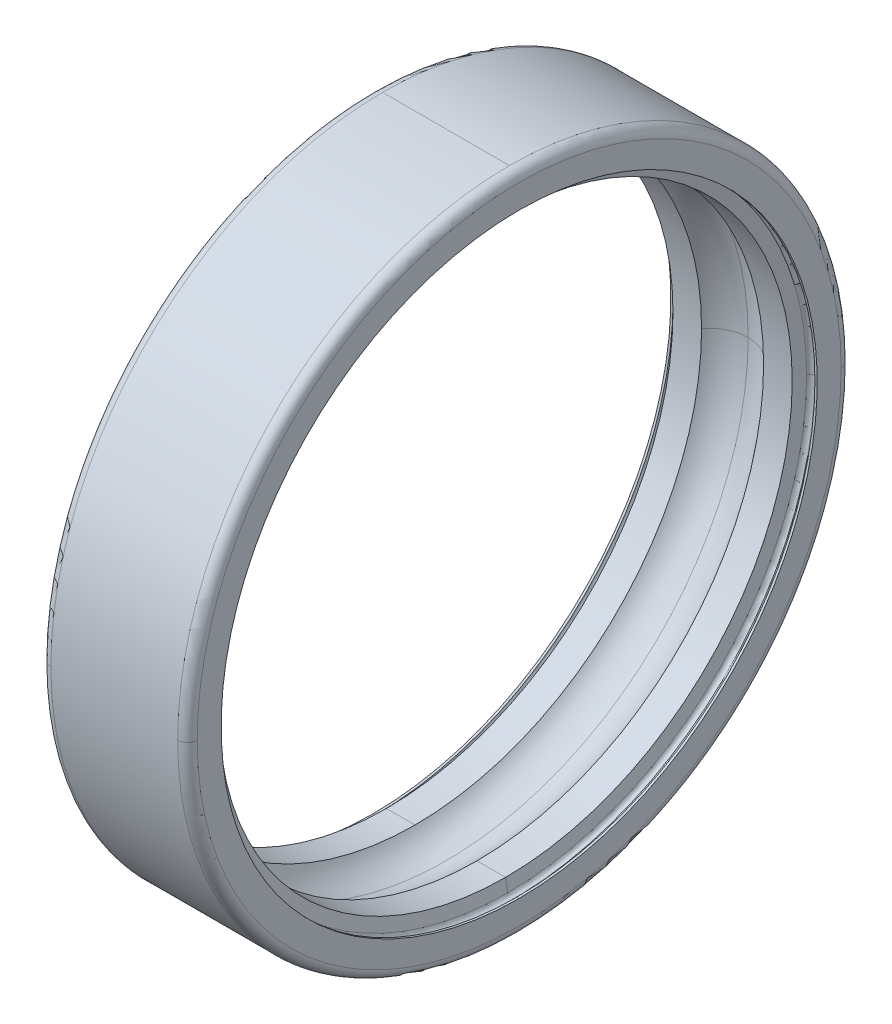
ISO-10303-21;
HEADER;
FILE_DESCRIPTION(('STEP AP214'),'2;1');
FILE_NAME('part.step','',(''),(''),'','','');
FILE_SCHEMA(('AUTOMOTIVE_DESIGN { 1 0 10303 214 1 1 1 1 }'));
ENDSEC;
DATA;
#1=APPLICATION_CONTEXT('core data for automotive mechanical design processes');
#2=APPLICATION_PROTOCOL_DEFINITION('international standard','automotive_design',2000,#1);
#3=PRODUCT_CONTEXT('',#1,'mechanical');
#4=PRODUCT('Part','Part','',(#3));
#5=PRODUCT_RELATED_PRODUCT_CATEGORY('part','',(#4));
#6=PRODUCT_DEFINITION_FORMATION('','',#4);
#7=PRODUCT_DEFINITION_CONTEXT('part definition',#1,'design');
#8=PRODUCT_DEFINITION('design','',#6,#7);
#9=PRODUCT_DEFINITION_SHAPE('','',#8);
#10=(LENGTH_UNIT() NAMED_UNIT(*) SI_UNIT(.MILLI.,.METRE.));
#11=(NAMED_UNIT(*) PLANE_ANGLE_UNIT() SI_UNIT($,.RADIAN.));
#12=(NAMED_UNIT(*) SI_UNIT($,.STERADIAN.) SOLID_ANGLE_UNIT());
#13=UNCERTAINTY_MEASURE_WITH_UNIT(LENGTH_MEASURE(1.E-05),#10,'distance_accuracy_value','');
#14=(GEOMETRIC_REPRESENTATION_CONTEXT(3) GLOBAL_UNCERTAINTY_ASSIGNED_CONTEXT((#13)) GLOBAL_UNIT_ASSIGNED_CONTEXT((#10,
#11,#12)) REPRESENTATION_CONTEXT('',''));
#15=CARTESIAN_POINT('',(0.,0.,0.));
#16=DIRECTION('',(0.,0.,1.));
#17=DIRECTION('',(1.,0.,0.));
#18=AXIS2_PLACEMENT_3D('',#15,#16,#17);
#19=CARTESIAN_POINT('',(14.295,0.,0.));
#20=DIRECTION('',(1.,0.,0.));
#21=DIRECTION('',(0.,0.,-1.));
#22=AXIS2_PLACEMENT_3D('',#19,#20,#21);
#23=TOROIDAL_SURFACE('',#22,30.55,0.47);
#24=CARTESIAN_POINT('',(14.295,0.,0.));
#25=DIRECTION('',(1.,0.,0.));
#26=DIRECTION('',(0.,0.,1.));
#27=AXIS2_PLACEMENT_3D('',#24,#25,#26);
#28=CIRCLE('',#27,31.02);
#29=CARTESIAN_POINT('',(14.295,0.,-31.02));
#30=VERTEX_POINT('',#29);
#31=CARTESIAN_POINT('',(14.295,0.,31.02));
#32=VERTEX_POINT('',#31);
#33=EDGE_CURVE('E435',#30,#32,#28,.T.);
#34=ORIENTED_EDGE('',*,*,#33,.T.);
#35=CARTESIAN_POINT('',(14.295,0.,30.55));
#36=DIRECTION('',(0.,-1.,0.));
#37=DIRECTION('',(0.,0.,1.));
#38=AXIS2_PLACEMENT_3D('',#35,#36,#37);
#39=CIRCLE('',#38,0.47);
#40=CARTESIAN_POINT('',(13.8321403560843,0.,30.6316146435035));
#41=VERTEX_POINT('',#40);
#42=EDGE_CURVE('E356',#32,#41,#39,.T.);
#43=ORIENTED_EDGE('',*,*,#42,.T.);
#44=CARTESIAN_POINT('',(13.8321403560843,0.,0.));
#45=DIRECTION('',(1.,0.,0.));
#46=DIRECTION('',(0.,1.,0.));
#47=AXIS2_PLACEMENT_3D('',#44,#45,#46);
#48=CIRCLE('',#47,30.6316146435035);
#49=CARTESIAN_POINT('',(13.8321403560843,30.6316146435035,0.));
#50=VERTEX_POINT('',#49);
#51=EDGE_CURVE('E31',#50,#41,#48,.T.);
#52=ORIENTED_EDGE('',*,*,#51,.F.);
#53=CARTESIAN_POINT('',(13.8321403560843,0.,0.));
#54=DIRECTION('',(1.,0.,0.));
#55=DIRECTION('',(0.,1.,0.));
#56=AXIS2_PLACEMENT_3D('',#53,#54,#55);
#57=CIRCLE('',#56,30.6316146435035);
#58=CARTESIAN_POINT('',(13.8321403560843,0.,-30.6316146435035));
#59=VERTEX_POINT('',#58);
#60=EDGE_CURVE('E185',#59,#50,#57,.T.);
#61=ORIENTED_EDGE('',*,*,#60,.F.);
#62=CARTESIAN_POINT('',(14.295,0.,-30.55));
#63=DIRECTION('',(0.,-1.,0.));
#64=DIRECTION('',(0.,0.,-1.));
#65=AXIS2_PLACEMENT_3D('',#62,#63,#64);
#66=CIRCLE('',#65,0.47);
#67=EDGE_CURVE('E347',#59,#30,#66,.T.);
#68=ORIENTED_EDGE('',*,*,#67,.T.);
#69=EDGE_LOOP('',(#34,#43,#52,#61,#68));
#70=FACE_BOUND('',#69,.T.);
#71=ADVANCED_FACE('F16',(#70),#23,.F.);
#72=CARTESIAN_POINT('',(14.8825,0.,0.));
#73=DIRECTION('',(1.,0.,0.));
#74=DIRECTION('',(0.,1.,0.));
#75=AXIS2_PLACEMENT_3D('',#72,#73,#74);
#76=CYLINDRICAL_SURFACE('',#75,30.55);
#77=DIRECTION('',(1.,0.,0.));
#78=VECTOR('',#77,1.);
#79=CARTESIAN_POINT('',(14.8825,30.55,0.));
#80=LINE('',#79,#78);
#81=CARTESIAN_POINT('',(14.765,30.55,0.));
#82=VERTEX_POINT('',#81);
#83=CARTESIAN_POINT('',(15.,30.55,0.));
#84=VERTEX_POINT('',#83);
#85=EDGE_CURVE('E358',#82,#84,#80,.T.);
#86=ORIENTED_EDGE('',*,*,#85,.T.);
#87=CARTESIAN_POINT('',(15.,0.,0.));
#88=DIRECTION('',(1.,0.,0.));
#89=DIRECTION('',(0.,1.,0.));
#90=AXIS2_PLACEMENT_3D('',#87,#88,#89);
#91=CIRCLE('',#90,30.55);
#92=CARTESIAN_POINT('',(15.,-30.55,0.));
#93=VERTEX_POINT('',#92);
#94=EDGE_CURVE('E11',#84,#93,#91,.T.);
#95=ORIENTED_EDGE('',*,*,#94,.T.);
#96=DIRECTION('',(-1.,0.,0.));
#97=VECTOR('',#96,1.);
#98=CARTESIAN_POINT('',(14.8825,-30.55,0.));
#99=LINE('',#98,#97);
#100=CARTESIAN_POINT('',(14.765,-30.55,0.));
#101=VERTEX_POINT('',#100);
#102=EDGE_CURVE('E224',#93,#101,#99,.T.);
#103=ORIENTED_EDGE('',*,*,#102,.T.);
#104=CARTESIAN_POINT('',(14.765,0.,0.));
#105=DIRECTION('',(1.,0.,0.));
#106=DIRECTION('',(0.,1.,0.));
#107=AXIS2_PLACEMENT_3D('',#104,#105,#106);
#108=CIRCLE('',#107,30.55);
#109=CARTESIAN_POINT('',(14.765,0.,30.55));
#110=VERTEX_POINT('',#109);
#111=EDGE_CURVE('E341',#110,#101,#108,.T.);
#112=ORIENTED_EDGE('',*,*,#111,.F.);
#113=CARTESIAN_POINT('',(14.765,0.,0.));
#114=DIRECTION('',(1.,0.,0.));
#115=DIRECTION('',(0.,1.,0.));
#116=AXIS2_PLACEMENT_3D('',#113,#114,#115);
#117=CIRCLE('',#116,30.55);
#118=EDGE_CURVE('E390',#82,#110,#117,.T.);
#119=ORIENTED_EDGE('',*,*,#118,.F.);
#120=EDGE_LOOP('',(#86,#95,#103,#112,#119));
#121=FACE_BOUND('',#120,.T.);
#122=ADVANCED_FACE('F18',(#121),#76,.F.);
#123=CARTESIAN_POINT('',(15.,31.775,0.));
#124=DIRECTION('',(1.,0.,0.));
#125=DIRECTION('',(0.,1.,0.));
#126=AXIS2_PLACEMENT_3D('',#123,#124,#125);
#127=PLANE('',#126);
#128=ORIENTED_EDGE('',*,*,#94,.F.);
#129=CARTESIAN_POINT('',(15.,0.,0.));
#130=DIRECTION('',(1.,0.,0.));
#131=DIRECTION('',(0.,1.,0.));
#132=AXIS2_PLACEMENT_3D('',#129,#130,#131);
#133=CIRCLE('',#132,30.55);
#134=EDGE_CURVE('E219',#93,#84,#133,.T.);
#135=ORIENTED_EDGE('',*,*,#134,.F.);
#136=EDGE_LOOP('',(#128,#135));
#137=FACE_BOUND('',#136,.T.);
#138=CARTESIAN_POINT('',(15.,0.,0.));
#139=DIRECTION('',(1.,0.,0.));
#140=DIRECTION('',(0.,1.,0.));
#141=AXIS2_PLACEMENT_3D('',#138,#139,#140);
#142=CIRCLE('',#141,33.);
#143=CARTESIAN_POINT('',(15.,0.,33.));
#144=VERTEX_POINT('',#143);
#145=CARTESIAN_POINT('',(15.,0.,-33.));
#146=VERTEX_POINT('',#145);
#147=EDGE_CURVE('E24',#144,#146,#142,.T.);
#148=ORIENTED_EDGE('',*,*,#147,.T.);
#149=CARTESIAN_POINT('',(15.,0.,0.));
#150=DIRECTION('',(1.,0.,0.));
#151=DIRECTION('',(0.,1.,0.));
#152=AXIS2_PLACEMENT_3D('',#149,#150,#151);
#153=CIRCLE('',#152,33.);
#154=EDGE_CURVE('E198',#146,#144,#153,.T.);
#155=ORIENTED_EDGE('',*,*,#154,.T.);
#156=EDGE_LOOP('',(#148,#155));
#157=FACE_BOUND('',#156,.T.);
#158=ADVANCED_FACE('F197',(#137,#157),#127,.T.);
#159=CARTESIAN_POINT('',(14.,0.,0.));
#160=DIRECTION('',(1.,0.,0.));
#161=DIRECTION('',(0.,0.,-1.));
#162=AXIS2_PLACEMENT_3D('',#159,#160,#161);
#163=TOROIDAL_SURFACE('',#162,33.,1.);
#164=CARTESIAN_POINT('',(14.,0.,-33.));
#165=DIRECTION('',(0.,-1.,0.));
#166=DIRECTION('',(0.,0.,-1.));
#167=AXIS2_PLACEMENT_3D('',#164,#165,#166);
#168=CIRCLE('',#167,1.);
#169=CARTESIAN_POINT('',(14.,0.,-34.));
#170=VERTEX_POINT('',#169);
#171=EDGE_CURVE('E209',#170,#146,#168,.T.);
#172=ORIENTED_EDGE('',*,*,#171,.T.);
#173=ORIENTED_EDGE('',*,*,#147,.F.);
#174=CARTESIAN_POINT('',(14.,0.,33.));
#175=DIRECTION('',(0.,-1.,0.));
#176=DIRECTION('',(0.,0.,1.));
#177=AXIS2_PLACEMENT_3D('',#174,#175,#176);
#178=CIRCLE('',#177,1.);
#179=CARTESIAN_POINT('',(14.,0.,34.));
#180=VERTEX_POINT('',#179);
#181=EDGE_CURVE('E211',#144,#180,#178,.T.);
#182=ORIENTED_EDGE('',*,*,#181,.T.);
#183=CARTESIAN_POINT('',(14.,0.,0.));
#184=DIRECTION('',(1.,0.,0.));
#185=DIRECTION('',(0.,1.,0.));
#186=AXIS2_PLACEMENT_3D('',#183,#184,#185);
#187=CIRCLE('',#186,34.);
#188=CARTESIAN_POINT('',(14.,-34.,0.));
#189=VERTEX_POINT('',#188);
#190=EDGE_CURVE('E238',#180,#189,#187,.T.);
#191=ORIENTED_EDGE('',*,*,#190,.T.);
#192=CARTESIAN_POINT('',(14.,0.,0.));
#193=DIRECTION('',(1.,0.,0.));
#194=DIRECTION('',(0.,1.,0.));
#195=AXIS2_PLACEMENT_3D('',#192,#193,#194);
#196=CIRCLE('',#195,34.);
#197=EDGE_CURVE('E191',#189,#170,#196,.T.);
#198=ORIENTED_EDGE('',*,*,#197,.T.);
#199=EDGE_LOOP('',(#172,#173,#182,#191,#198));
#200=FACE_BOUND('',#199,.T.);
#201=ADVANCED_FACE('F214',(#200),#163,.T.);
#202=CARTESIAN_POINT('',(7.5,0.,0.));
#203=DIRECTION('',(1.,0.,0.));
#204=DIRECTION('',(0.,1.,0.));
#205=AXIS2_PLACEMENT_3D('',#202,#203,#204);
#206=CYLINDRICAL_SURFACE('',#205,34.);
#207=DIRECTION('',(1.,0.,0.));
#208=VECTOR('',#207,1.);
#209=CARTESIAN_POINT('',(7.5,34.,0.));
#210=LINE('',#209,#208);
#211=CARTESIAN_POINT('',(1.,34.,0.));
#212=VERTEX_POINT('',#211);
#213=CARTESIAN_POINT('',(14.,34.,0.));
#214=VERTEX_POINT('',#213);
#215=EDGE_CURVE('E212',#212,#214,#210,.T.);
#216=ORIENTED_EDGE('',*,*,#215,.T.);
#217=CARTESIAN_POINT('',(14.,0.,0.));
#218=DIRECTION('',(1.,0.,0.));
#219=DIRECTION('',(0.,1.,0.));
#220=AXIS2_PLACEMENT_3D('',#217,#218,#219);
#221=CIRCLE('',#220,34.);
#222=EDGE_CURVE('E218',#170,#214,#221,.T.);
#223=ORIENTED_EDGE('',*,*,#222,.F.);
#224=ORIENTED_EDGE('',*,*,#197,.F.);
#225=DIRECTION('',(-1.,0.,0.));
#226=VECTOR('',#225,1.);
#227=CARTESIAN_POINT('',(7.5,-34.,0.));
#228=LINE('',#227,#226);
#229=CARTESIAN_POINT('',(1.,-34.,0.));
#230=VERTEX_POINT('',#229);
#231=EDGE_CURVE('E235',#189,#230,#228,.T.);
#232=ORIENTED_EDGE('',*,*,#231,.T.);
#233=CARTESIAN_POINT('',(1.,0.,0.));
#234=DIRECTION('',(1.,0.,0.));
#235=DIRECTION('',(0.,1.,0.));
#236=AXIS2_PLACEMENT_3D('',#233,#234,#235);
#237=CIRCLE('',#236,34.);
#238=CARTESIAN_POINT('',(1.,0.,-34.));
#239=VERTEX_POINT('',#238);
#240=EDGE_CURVE('E189',#230,#239,#237,.T.);
#241=ORIENTED_EDGE('',*,*,#240,.T.);
#242=CARTESIAN_POINT('',(1.,0.,0.));
#243=DIRECTION('',(1.,0.,0.));
#244=DIRECTION('',(0.,1.,0.));
#245=AXIS2_PLACEMENT_3D('',#242,#243,#244);
#246=CIRCLE('',#245,34.);
#247=EDGE_CURVE('E252',#239,#212,#246,.T.);
#248=ORIENTED_EDGE('',*,*,#247,.T.);
#249=EDGE_LOOP('',(#216,#223,#224,#232,#241,#248));
#250=FACE_BOUND('',#249,.T.);
#251=ADVANCED_FACE('F504',(#250),#206,.T.);
#252=CARTESIAN_POINT('',(1.,0.,0.));
#253=DIRECTION('',(1.,0.,0.));
#254=DIRECTION('',(0.,0.,-1.));
#255=AXIS2_PLACEMENT_3D('',#252,#253,#254);
#256=TOROIDAL_SURFACE('',#255,33.,1.);
#257=CARTESIAN_POINT('',(1.,0.,-33.));
#258=DIRECTION('',(0.,-1.,0.));
#259=DIRECTION('',(0.,0.,-1.));
#260=AXIS2_PLACEMENT_3D('',#257,#258,#259);
#261=CIRCLE('',#260,1.);
#262=CARTESIAN_POINT('',(0.,0.,-33.));
#263=VERTEX_POINT('',#262);
#264=EDGE_CURVE('E241',#263,#239,#261,.T.);
#265=ORIENTED_EDGE('',*,*,#264,.T.);
#266=ORIENTED_EDGE('',*,*,#240,.F.);
#267=CARTESIAN_POINT('',(1.,0.,0.));
#268=DIRECTION('',(1.,0.,0.));
#269=DIRECTION('',(0.,1.,0.));
#270=AXIS2_PLACEMENT_3D('',#267,#268,#269);
#271=CIRCLE('',#270,34.);
#272=CARTESIAN_POINT('',(1.,0.,34.));
#273=VERTEX_POINT('',#272);
#274=EDGE_CURVE('E234',#273,#230,#271,.T.);
#275=ORIENTED_EDGE('',*,*,#274,.F.);
#276=CARTESIAN_POINT('',(1.,0.,33.));
#277=DIRECTION('',(0.,-1.,0.));
#278=DIRECTION('',(0.,0.,1.));
#279=AXIS2_PLACEMENT_3D('',#276,#277,#278);
#280=CIRCLE('',#279,1.);
#281=CARTESIAN_POINT('',(0.,0.,33.));
#282=VERTEX_POINT('',#281);
#283=EDGE_CURVE('E249',#273,#282,#280,.T.);
#284=ORIENTED_EDGE('',*,*,#283,.T.);
#285=CARTESIAN_POINT('',(0.,0.,0.));
#286=DIRECTION('',(1.,0.,0.));
#287=DIRECTION('',(0.,1.,0.));
#288=AXIS2_PLACEMENT_3D('',#285,#286,#287);
#289=CIRCLE('',#288,33.);
#290=EDGE_CURVE('E192',#282,#263,#289,.T.);
#291=ORIENTED_EDGE('',*,*,#290,.T.);
#292=EDGE_LOOP('',(#265,#266,#275,#284,#291));
#293=FACE_BOUND('',#292,.T.);
#294=ADVANCED_FACE('F500',(#293),#256,.T.);
#295=CARTESIAN_POINT('',(0.,31.775,0.));
#296=DIRECTION('',(-1.,0.,0.));
#297=DIRECTION('',(0.,0.,1.));
#298=AXIS2_PLACEMENT_3D('',#295,#296,#297);
#299=PLANE('',#298);
#300=CARTESIAN_POINT('',(0.,0.,0.));
#301=DIRECTION('',(1.,0.,0.));
#302=DIRECTION('',(0.,1.,0.));
#303=AXIS2_PLACEMENT_3D('',#300,#301,#302);
#304=CIRCLE('',#303,30.55);
#305=CARTESIAN_POINT('',(0.,30.55,0.));
#306=VERTEX_POINT('',#305);
#307=CARTESIAN_POINT('',(0.,-30.55,0.));
#308=VERTEX_POINT('',#307);
#309=EDGE_CURVE('E254',#306,#308,#304,.T.);
#310=ORIENTED_EDGE('',*,*,#309,.T.);
#311=CARTESIAN_POINT('',(0.,0.,0.));
#312=DIRECTION('',(1.,0.,0.));
#313=DIRECTION('',(0.,1.,0.));
#314=AXIS2_PLACEMENT_3D('',#311,#312,#313);
#315=CIRCLE('',#314,30.55);
#316=EDGE_CURVE('E260',#308,#306,#315,.T.);
#317=ORIENTED_EDGE('',*,*,#316,.T.);
#318=EDGE_LOOP('',(#310,#317));
#319=FACE_BOUND('',#318,.T.);
#320=CARTESIAN_POINT('',(0.,0.,0.));
#321=DIRECTION('',(1.,0.,0.));
#322=DIRECTION('',(0.,1.,0.));
#323=AXIS2_PLACEMENT_3D('',#320,#321,#322);
#324=CIRCLE('',#323,33.);
#325=EDGE_CURVE('E244',#263,#282,#324,.T.);
#326=ORIENTED_EDGE('',*,*,#325,.F.);
#327=ORIENTED_EDGE('',*,*,#290,.F.);
#328=EDGE_LOOP('',(#326,#327));
#329=FACE_BOUND('',#328,.T.);
#330=ADVANCED_FACE('F496',(#319,#329),#299,.T.);
#331=CARTESIAN_POINT('',(0.1175,0.,0.));
#332=DIRECTION('',(1.,0.,0.));
#333=DIRECTION('',(0.,1.,0.));
#334=AXIS2_PLACEMENT_3D('',#331,#332,#333);
#335=CYLINDRICAL_SURFACE('',#334,30.55);
#336=DIRECTION('',(1.,0.,0.));
#337=VECTOR('',#336,1.);
#338=CARTESIAN_POINT('',(0.1175,30.55,0.));
#339=LINE('',#338,#337);
#340=CARTESIAN_POINT('',(0.235,30.55,0.));
#341=VERTEX_POINT('',#340);
#342=EDGE_CURVE('E256',#306,#341,#339,.T.);
#343=ORIENTED_EDGE('',*,*,#342,.T.);
#344=CARTESIAN_POINT('',(0.235,0.,0.));
#345=DIRECTION('',(1.,0.,0.));
#346=DIRECTION('',(0.,1.,0.));
#347=AXIS2_PLACEMENT_3D('',#344,#345,#346);
#348=CIRCLE('',#347,30.55);
#349=CARTESIAN_POINT('',(0.235,0.,30.55));
#350=VERTEX_POINT('',#349);
#351=EDGE_CURVE('E246',#341,#350,#348,.T.);
#352=ORIENTED_EDGE('',*,*,#351,.T.);
#353=CARTESIAN_POINT('',(0.235,0.,0.));
#354=DIRECTION('',(1.,0.,0.));
#355=DIRECTION('',(0.,1.,0.));
#356=AXIS2_PLACEMENT_3D('',#353,#354,#355);
#357=CIRCLE('',#356,30.55);
#358=CARTESIAN_POINT('',(0.235,-30.55,0.));
#359=VERTEX_POINT('',#358);
#360=EDGE_CURVE('E268',#350,#359,#357,.T.);
#361=ORIENTED_EDGE('',*,*,#360,.T.);
#362=DIRECTION('',(-1.,0.,0.));
#363=VECTOR('',#362,1.);
#364=CARTESIAN_POINT('',(0.1175,-30.55,0.));
#365=LINE('',#364,#363);
#366=EDGE_CURVE('E264',#359,#308,#365,.T.);
#367=ORIENTED_EDGE('',*,*,#366,.T.);
#368=ORIENTED_EDGE('',*,*,#309,.F.);
#369=EDGE_LOOP('',(#343,#352,#361,#367,#368));
#370=FACE_BOUND('',#369,.T.);
#371=ADVANCED_FACE('F499',(#370),#335,.F.);
#372=CARTESIAN_POINT('',(0.705,0.,0.));
#373=DIRECTION('',(1.,0.,0.));
#374=DIRECTION('',(0.,0.,-1.));
#375=AXIS2_PLACEMENT_3D('',#372,#373,#374);
#376=TOROIDAL_SURFACE('',#375,30.55,0.47);
#377=CARTESIAN_POINT('',(0.705,0.,0.));
#378=DIRECTION('',(1.,0.,0.));
#379=DIRECTION('',(0.,0.,1.));
#380=AXIS2_PLACEMENT_3D('',#377,#378,#379);
#381=CIRCLE('',#380,31.02);
#382=CARTESIAN_POINT('',(0.705,0.,-31.02));
#383=VERTEX_POINT('',#382);
#384=CARTESIAN_POINT('',(0.705,0.,31.02));
#385=VERTEX_POINT('',#384);
#386=EDGE_CURVE('E308',#383,#385,#381,.T.);
#387=ORIENTED_EDGE('',*,*,#386,.T.);
#388=CARTESIAN_POINT('',(0.705,0.,30.55));
#389=DIRECTION('',(0.,-1.,0.));
#390=DIRECTION('',(0.,0.,1.));
#391=AXIS2_PLACEMENT_3D('',#388,#389,#390);
#392=CIRCLE('',#391,0.47);
#393=EDGE_CURVE('E270',#385,#350,#392,.T.);
#394=ORIENTED_EDGE('',*,*,#393,.T.);
#395=ORIENTED_EDGE('',*,*,#351,.F.);
#396=CARTESIAN_POINT('',(0.235,0.,0.));
#397=DIRECTION('',(1.,0.,0.));
#398=DIRECTION('',(0.,1.,0.));
#399=AXIS2_PLACEMENT_3D('',#396,#397,#398);
#400=CIRCLE('',#399,30.55);
#401=CARTESIAN_POINT('',(0.235,0.,-30.55));
#402=VERTEX_POINT('',#401);
#403=EDGE_CURVE('E316',#402,#341,#400,.T.);
#404=ORIENTED_EDGE('',*,*,#403,.F.);
#405=CARTESIAN_POINT('',(0.705,0.,-30.55));
#406=DIRECTION('',(0.,-1.,0.));
#407=DIRECTION('',(0.,0.,-1.));
#408=AXIS2_PLACEMENT_3D('',#405,#406,#407);
#409=CIRCLE('',#408,0.47);
#410=EDGE_CURVE('E271',#402,#383,#409,.T.);
#411=ORIENTED_EDGE('',*,*,#410,.T.);
#412=EDGE_LOOP('',(#387,#394,#395,#404,#411));
#413=FACE_BOUND('',#412,.T.);
#414=ADVANCED_FACE('F459',(#413),#376,.F.);
#415=CARTESIAN_POINT('',(1.27864717691724,0.,0.));
#416=DIRECTION('',(-1.,0.,0.));
#417=DIRECTION('',(0.,1.,0.));
#418=AXIS2_PLACEMENT_3D('',#415,#416,#417);
#419=CONICAL_SURFACE('',#418,30.0033073217517,1.39626340159546);
#420=DIRECTION('',(0.173648177666931,-0.984807753012208,0.));
#421=VECTOR('',#420,1.);
#422=CARTESIAN_POINT('',(1.27864717691724,30.0033073217517,0.));
#423=LINE('',#422,#421);
#424=CARTESIAN_POINT('',(1.16785964391574,30.6316146435035,0.));
#425=VERTEX_POINT('',#424);
#426=CARTESIAN_POINT('',(1.38943470991875,29.375,0.));
#427=VERTEX_POINT('',#426);
#428=EDGE_CURVE('E274',#425,#427,#423,.T.);
#429=ORIENTED_EDGE('',*,*,#428,.T.);
#430=CARTESIAN_POINT('',(1.38943470991875,0.,0.));
#431=DIRECTION('',(1.,0.,0.));
#432=DIRECTION('',(0.,1.,0.));
#433=AXIS2_PLACEMENT_3D('',#430,#431,#432);
#434=CIRCLE('',#433,29.375);
#435=CARTESIAN_POINT('',(1.38943470991875,-29.375,0.));
#436=VERTEX_POINT('',#435);
#437=EDGE_CURVE('E240',#427,#436,#434,.T.);
#438=ORIENTED_EDGE('',*,*,#437,.T.);
#439=DIRECTION('',(-0.173648177666931,-0.984807753012208,0.));
#440=VECTOR('',#439,1.);
#441=CARTESIAN_POINT('',(1.27864717691724,-30.0033073217517,0.));
#442=LINE('',#441,#440);
#443=CARTESIAN_POINT('',(1.16785964391574,-30.6316146435035,0.));
#444=VERTEX_POINT('',#443);
#445=EDGE_CURVE('E277',#436,#444,#442,.T.);
#446=ORIENTED_EDGE('',*,*,#445,.T.);
#447=CARTESIAN_POINT('',(1.16785964391574,0.,0.));
#448=DIRECTION('',(1.,0.,0.));
#449=DIRECTION('',(0.,1.,0.));
#450=AXIS2_PLACEMENT_3D('',#447,#448,#449);
#451=CIRCLE('',#450,30.6316146435035);
#452=CARTESIAN_POINT('',(1.16785964391574,0.,30.6316146435035));
#453=VERTEX_POINT('',#452);
#454=EDGE_CURVE('E295',#453,#444,#451,.T.);
#455=ORIENTED_EDGE('',*,*,#454,.F.);
#456=CARTESIAN_POINT('',(1.16785964391574,0.,0.));
#457=DIRECTION('',(1.,0.,0.));
#458=DIRECTION('',(0.,1.,0.));
#459=AXIS2_PLACEMENT_3D('',#456,#457,#458);
#460=CIRCLE('',#459,30.6316146435035);
#461=EDGE_CURVE('E292',#425,#453,#460,.T.);
#462=ORIENTED_EDGE('',*,*,#461,.F.);
#463=EDGE_LOOP('',(#429,#438,#446,#455,#462));
#464=FACE_BOUND('',#463,.T.);
#465=ADVANCED_FACE('F290',(#464),#419,.F.);
#466=CARTESIAN_POINT('',(2.85472238641388,0.,0.));
#467=DIRECTION('',(1.,0.,0.));
#468=DIRECTION('',(0.,1.,0.));
#469=AXIS2_PLACEMENT_3D('',#466,#467,#468);
#470=CYLINDRICAL_SURFACE('',#469,29.375);
#471=DIRECTION('',(1.,0.,0.));
#472=VECTOR('',#471,1.);
#473=CARTESIAN_POINT('',(2.85472238641388,29.375,0.));
#474=LINE('',#473,#472);
#475=CARTESIAN_POINT('',(4.320010062909,29.375,0.));
#476=VERTEX_POINT('',#475);
#477=EDGE_CURVE('E169',#427,#476,#474,.T.);
#478=ORIENTED_EDGE('',*,*,#477,.T.);
#479=CARTESIAN_POINT('',(4.320010062909,0.,0.));
#480=DIRECTION('',(1.,0.,0.));
#481=DIRECTION('',(0.,1.,0.));
#482=AXIS2_PLACEMENT_3D('',#479,#480,#481);
#483=CIRCLE('',#482,29.375);
#484=CARTESIAN_POINT('',(4.320010062909,0.,29.375));
#485=VERTEX_POINT('',#484);
#486=EDGE_CURVE('E159',#476,#485,#483,.T.);
#487=ORIENTED_EDGE('',*,*,#486,.T.);
#488=CARTESIAN_POINT('',(4.320010062909,0.,0.));
#489=DIRECTION('',(1.,0.,0.));
#490=DIRECTION('',(0.,1.,0.));
#491=AXIS2_PLACEMENT_3D('',#488,#489,#490);
#492=CIRCLE('',#491,29.375);
#493=CARTESIAN_POINT('',(4.320010062909,-29.375,0.));
#494=VERTEX_POINT('',#493);
#495=EDGE_CURVE('E153',#485,#494,#492,.T.);
#496=ORIENTED_EDGE('',*,*,#495,.T.);
#497=DIRECTION('',(-1.,0.,0.));
#498=VECTOR('',#497,1.);
#499=CARTESIAN_POINT('',(2.85472238641388,-29.375,0.));
#500=LINE('',#499,#498);
#501=EDGE_CURVE('E167',#494,#436,#500,.T.);
#502=ORIENTED_EDGE('',*,*,#501,.T.);
#503=ORIENTED_EDGE('',*,*,#437,.F.);
#504=EDGE_LOOP('',(#478,#487,#496,#502,#503));
#505=FACE_BOUND('',#504,.T.);
#506=ADVANCED_FACE('F282',(#505),#470,.F.);
#507=CARTESIAN_POINT('',(7.5,0.,0.));
#508=DIRECTION('',(1.,0.,0.));
#509=DIRECTION('',(0.,0.,-1.));
#510=AXIS2_PLACEMENT_3D('',#507,#508,#509);
#511=TOROIDAL_SURFACE('',#510,27.,3.969);
#512=CARTESIAN_POINT('',(7.5,0.,0.));
#513=DIRECTION('',(1.,0.,0.));
#514=DIRECTION('',(0.,0.,1.));
#515=AXIS2_PLACEMENT_3D('',#512,#513,#514);
#516=CIRCLE('',#515,30.969);
#517=CARTESIAN_POINT('',(7.5,0.,-30.969));
#518=VERTEX_POINT('',#517);
#519=CARTESIAN_POINT('',(7.5,0.,30.969));
#520=VERTEX_POINT('',#519);
#521=EDGE_CURVE('E313',#518,#520,#516,.T.);
#522=ORIENTED_EDGE('',*,*,#521,.T.);
#523=CARTESIAN_POINT('',(7.5,0.,27.));
#524=DIRECTION('',(0.,-1.,0.));
#525=DIRECTION('',(0.,0.,1.));
#526=AXIS2_PLACEMENT_3D('',#523,#524,#525);
#527=CIRCLE('',#526,3.969);
#528=EDGE_CURVE('E174',#520,#485,#527,.T.);
#529=ORIENTED_EDGE('',*,*,#528,.T.);
#530=ORIENTED_EDGE('',*,*,#486,.F.);
#531=CARTESIAN_POINT('',(4.320010062909,0.,0.));
#532=DIRECTION('',(1.,0.,0.));
#533=DIRECTION('',(0.,1.,0.));
#534=AXIS2_PLACEMENT_3D('',#531,#532,#533);
#535=CIRCLE('',#534,29.375);
#536=CARTESIAN_POINT('',(4.320010062909,0.,-29.375));
#537=VERTEX_POINT('',#536);
#538=EDGE_CURVE('E154',#537,#476,#535,.T.);
#539=ORIENTED_EDGE('',*,*,#538,.F.);
#540=CARTESIAN_POINT('',(7.5,0.,-27.));
#541=DIRECTION('',(0.,-1.,0.));
#542=DIRECTION('',(0.,0.,-1.));
#543=AXIS2_PLACEMENT_3D('',#540,#541,#542);
#544=CIRCLE('',#543,3.969);
#545=EDGE_CURVE('E140',#537,#518,#544,.T.);
#546=ORIENTED_EDGE('',*,*,#545,.T.);
#547=EDGE_LOOP('',(#522,#529,#530,#539,#546));
#548=FACE_BOUND('',#547,.T.);
#549=ADVANCED_FACE('F157',(#548),#511,.F.);
#550=CARTESIAN_POINT('',(12.1452776135861,0.,0.));
#551=DIRECTION('',(1.,0.,0.));
#552=DIRECTION('',(0.,1.,0.));
#553=AXIS2_PLACEMENT_3D('',#550,#551,#552);
#554=CYLINDRICAL_SURFACE('',#553,29.375);
#555=DIRECTION('',(1.,0.,0.));
#556=VECTOR('',#555,1.);
#557=CARTESIAN_POINT('',(12.1452776135861,29.375,0.));
#558=LINE('',#557,#556);
#559=CARTESIAN_POINT('',(10.679989937091,29.375,0.));
#560=VERTEX_POINT('',#559);
#561=CARTESIAN_POINT('',(13.6105652900812,29.375,0.));
#562=VERTEX_POINT('',#561);
#563=EDGE_CURVE('E176',#560,#562,#558,.T.);
#564=ORIENTED_EDGE('',*,*,#563,.T.);
#565=CARTESIAN_POINT('',(13.6105652900812,0.,0.));
#566=DIRECTION('',(1.,0.,0.));
#567=DIRECTION('',(0.,1.,0.));
#568=AXIS2_PLACEMENT_3D('',#565,#566,#567);
#569=CIRCLE('',#568,29.375);
#570=CARTESIAN_POINT('',(13.6105652900812,-29.375,0.));
#571=VERTEX_POINT('',#570);
#572=EDGE_CURVE('E40',#562,#571,#569,.T.);
#573=ORIENTED_EDGE('',*,*,#572,.T.);
#574=DIRECTION('',(-1.,0.,0.));
#575=VECTOR('',#574,1.);
#576=CARTESIAN_POINT('',(12.1452776135861,-29.375,0.));
#577=LINE('',#576,#575);
#578=CARTESIAN_POINT('',(10.679989937091,-29.375,0.));
#579=VERTEX_POINT('',#578);
#580=EDGE_CURVE('E178',#571,#579,#577,.T.);
#581=ORIENTED_EDGE('',*,*,#580,.T.);
#582=CARTESIAN_POINT('',(10.679989937091,0.,0.));
#583=DIRECTION('',(1.,0.,0.));
#584=DIRECTION('',(0.,1.,0.));
#585=AXIS2_PLACEMENT_3D('',#582,#583,#584);
#586=CIRCLE('',#585,29.375);
#587=CARTESIAN_POINT('',(10.679989937091,0.,29.375));
#588=VERTEX_POINT('',#587);
#589=EDGE_CURVE('E320',#588,#579,#586,.T.);
#590=ORIENTED_EDGE('',*,*,#589,.F.);
#591=CARTESIAN_POINT('',(10.679989937091,0.,0.));
#592=DIRECTION('',(1.,0.,0.));
#593=DIRECTION('',(0.,1.,0.));
#594=AXIS2_PLACEMENT_3D('',#591,#592,#593);
#595=CIRCLE('',#594,29.375);
#596=EDGE_CURVE('E421',#560,#588,#595,.T.);
#597=ORIENTED_EDGE('',*,*,#596,.F.);
#598=EDGE_LOOP('',(#564,#573,#581,#590,#597));
#599=FACE_BOUND('',#598,.T.);
#600=ADVANCED_FACE('F418',(#599),#554,.F.);
#601=CARTESIAN_POINT('',(13.7213528230828,0.,0.));
#602=DIRECTION('',(1.,0.,0.));
#603=DIRECTION('',(0.,1.,0.));
#604=AXIS2_PLACEMENT_3D('',#601,#602,#603);
#605=CONICAL_SURFACE('',#604,30.0033073217517,1.39626340159546);
#606=DIRECTION('',(0.173648177666934,0.984807753012207,0.));
#607=VECTOR('',#606,1.);
#608=CARTESIAN_POINT('',(13.7213528230828,30.0033073217517,0.));
#609=LINE('',#608,#607);
#610=EDGE_CURVE('E181',#562,#50,#609,.T.);
#611=ORIENTED_EDGE('',*,*,#610,.T.);
#612=ORIENTED_EDGE('',*,*,#51,.T.);
#613=CARTESIAN_POINT('',(13.8321403560843,0.,0.));
#614=DIRECTION('',(1.,0.,0.));
#615=DIRECTION('',(0.,1.,0.));
#616=AXIS2_PLACEMENT_3D('',#613,#614,#615);
#617=CIRCLE('',#616,30.6316146435035);
#618=CARTESIAN_POINT('',(13.8321403560843,-30.6316146435035,0.));
#619=VERTEX_POINT('',#618);
#620=EDGE_CURVE('E353',#41,#619,#617,.T.);
#621=ORIENTED_EDGE('',*,*,#620,.T.);
#622=DIRECTION('',(-0.173648177666934,0.984807753012207,0.));
#623=VECTOR('',#622,1.);
#624=CARTESIAN_POINT('',(13.7213528230828,-30.0033073217517,0.));
#625=LINE('',#624,#623);
#626=EDGE_CURVE('E184',#619,#571,#625,.T.);
#627=ORIENTED_EDGE('',*,*,#626,.T.);
#628=ORIENTED_EDGE('',*,*,#572,.F.);
#629=EDGE_LOOP('',(#611,#612,#621,#627,#628));
#630=FACE_BOUND('',#629,.T.);
#631=ADVANCED_FACE('F486',(#630),#605,.F.);
#632=CARTESIAN_POINT('',(13.7213528230828,0.,0.));
#633=DIRECTION('',(1.,0.,0.));
#634=DIRECTION('',(0.,1.,0.));
#635=AXIS2_PLACEMENT_3D('',#632,#633,#634);
#636=CONICAL_SURFACE('',#635,30.0033073217517,1.39626340159546);
#637=ORIENTED_EDGE('',*,*,#610,.F.);
#638=CARTESIAN_POINT('',(13.6105652900812,0.,0.));
#639=DIRECTION('',(1.,0.,0.));
#640=DIRECTION('',(0.,1.,0.));
#641=AXIS2_PLACEMENT_3D('',#638,#639,#640);
#642=CIRCLE('',#641,29.375);
#643=EDGE_CURVE('E180',#571,#562,#642,.T.);
#644=ORIENTED_EDGE('',*,*,#643,.F.);
#645=ORIENTED_EDGE('',*,*,#626,.F.);
#646=CARTESIAN_POINT('',(13.8321403560843,0.,0.));
#647=DIRECTION('',(1.,0.,0.));
#648=DIRECTION('',(0.,1.,0.));
#649=AXIS2_PLACEMENT_3D('',#646,#647,#648);
#650=CIRCLE('',#649,30.6316146435035);
#651=EDGE_CURVE('E350',#619,#59,#650,.T.);
#652=ORIENTED_EDGE('',*,*,#651,.T.);
#653=ORIENTED_EDGE('',*,*,#60,.T.);
#654=EDGE_LOOP('',(#637,#644,#645,#652,#653));
#655=FACE_BOUND('',#654,.T.);
#656=ADVANCED_FACE('F483',(#655),#636,.F.);
#657=CARTESIAN_POINT('',(12.1452776135861,0.,0.));
#658=DIRECTION('',(1.,0.,0.));
#659=DIRECTION('',(0.,1.,0.));
#660=AXIS2_PLACEMENT_3D('',#657,#658,#659);
#661=CYLINDRICAL_SURFACE('',#660,29.375);
#662=ORIENTED_EDGE('',*,*,#563,.F.);
#663=CARTESIAN_POINT('',(10.679989937091,0.,0.));
#664=DIRECTION('',(1.,0.,0.));
#665=DIRECTION('',(0.,1.,0.));
#666=AXIS2_PLACEMENT_3D('',#663,#664,#665);
#667=CIRCLE('',#666,29.375);
#668=CARTESIAN_POINT('',(10.679989937091,0.,-29.375));
#669=VERTEX_POINT('',#668);
#670=EDGE_CURVE('E403',#669,#560,#667,.T.);
#671=ORIENTED_EDGE('',*,*,#670,.F.);
#672=CARTESIAN_POINT('',(10.679989937091,0.,0.));
#673=DIRECTION('',(1.,0.,0.));
#674=DIRECTION('',(0.,1.,0.));
#675=AXIS2_PLACEMENT_3D('',#672,#673,#674);
#676=CIRCLE('',#675,29.375);
#677=EDGE_CURVE('E324',#579,#669,#676,.T.);
#678=ORIENTED_EDGE('',*,*,#677,.F.);
#679=ORIENTED_EDGE('',*,*,#580,.F.);
#680=ORIENTED_EDGE('',*,*,#643,.T.);
#681=EDGE_LOOP('',(#662,#671,#678,#679,#680));
#682=FACE_BOUND('',#681,.T.);
#683=ADVANCED_FACE('F411',(#682),#661,.F.);
#684=CARTESIAN_POINT('',(7.5,0.,0.));
#685=DIRECTION('',(1.,0.,0.));
#686=DIRECTION('',(0.,0.,-1.));
#687=AXIS2_PLACEMENT_3D('',#684,#685,#686);
#688=TOROIDAL_SURFACE('',#687,27.,3.969);
#689=CARTESIAN_POINT('',(7.5,0.,0.));
#690=DIRECTION('',(1.,0.,0.));
#691=DIRECTION('',(0.,0.,1.));
#692=AXIS2_PLACEMENT_3D('',#689,#690,#691);
#693=CIRCLE('',#692,30.969);
#694=EDGE_CURVE('E149',#520,#518,#693,.T.);
#695=ORIENTED_EDGE('',*,*,#694,.T.);
#696=ORIENTED_EDGE('',*,*,#545,.F.);
#697=CARTESIAN_POINT('',(4.320010062909,0.,0.));
#698=DIRECTION('',(1.,0.,0.));
#699=DIRECTION('',(0.,1.,0.));
#700=AXIS2_PLACEMENT_3D('',#697,#698,#699);
#701=CIRCLE('',#700,29.375);
#702=EDGE_CURVE('E145',#494,#537,#701,.T.);
#703=ORIENTED_EDGE('',*,*,#702,.F.);
#704=ORIENTED_EDGE('',*,*,#495,.F.);
#705=ORIENTED_EDGE('',*,*,#528,.F.);
#706=EDGE_LOOP('',(#695,#696,#703,#704,#705));
#707=FACE_BOUND('',#706,.T.);
#708=ADVANCED_FACE('F142',(#707),#688,.F.);
#709=CARTESIAN_POINT('',(2.85472238641388,0.,0.));
#710=DIRECTION('',(1.,0.,0.));
#711=DIRECTION('',(0.,1.,0.));
#712=AXIS2_PLACEMENT_3D('',#709,#710,#711);
#713=CYLINDRICAL_SURFACE('',#712,29.375);
#714=ORIENTED_EDGE('',*,*,#477,.F.);
#715=CARTESIAN_POINT('',(1.38943470991875,0.,0.));
#716=DIRECTION('',(1.,0.,0.));
#717=DIRECTION('',(0.,1.,0.));
#718=AXIS2_PLACEMENT_3D('',#715,#716,#717);
#719=CIRCLE('',#718,29.375);
#720=EDGE_CURVE('E279',#436,#427,#719,.T.);
#721=ORIENTED_EDGE('',*,*,#720,.F.);
#722=ORIENTED_EDGE('',*,*,#501,.F.);
#723=ORIENTED_EDGE('',*,*,#702,.T.);
#724=ORIENTED_EDGE('',*,*,#538,.T.);
#725=EDGE_LOOP('',(#714,#721,#722,#723,#724));
#726=FACE_BOUND('',#725,.T.);
#727=ADVANCED_FACE('F164',(#726),#713,.F.);
#728=CARTESIAN_POINT('',(1.27864717691724,0.,0.));
#729=DIRECTION('',(-1.,0.,0.));
#730=DIRECTION('',(0.,1.,0.));
#731=AXIS2_PLACEMENT_3D('',#728,#729,#730);
#732=CONICAL_SURFACE('',#731,30.0033073217517,1.39626340159546);
#733=ORIENTED_EDGE('',*,*,#428,.F.);
#734=CARTESIAN_POINT('',(1.16785964391574,0.,0.));
#735=DIRECTION('',(1.,0.,0.));
#736=DIRECTION('',(0.,1.,0.));
#737=AXIS2_PLACEMENT_3D('',#734,#735,#736);
#738=CIRCLE('',#737,30.6316146435035);
#739=CARTESIAN_POINT('',(1.16785964391574,0.,-30.6316146435035));
#740=VERTEX_POINT('',#739);
#741=EDGE_CURVE('E300',#740,#425,#738,.T.);
#742=ORIENTED_EDGE('',*,*,#741,.F.);
#743=CARTESIAN_POINT('',(1.16785964391574,0.,0.));
#744=DIRECTION('',(1.,0.,0.));
#745=DIRECTION('',(0.,1.,0.));
#746=AXIS2_PLACEMENT_3D('',#743,#744,#745);
#747=CIRCLE('',#746,30.6316146435035);
#748=EDGE_CURVE('E333',#444,#740,#747,.T.);
#749=ORIENTED_EDGE('',*,*,#748,.F.);
#750=ORIENTED_EDGE('',*,*,#445,.F.);
#751=ORIENTED_EDGE('',*,*,#720,.T.);
#752=EDGE_LOOP('',(#733,#742,#749,#750,#751));
#753=FACE_BOUND('',#752,.T.);
#754=ADVANCED_FACE('F285',(#753),#732,.F.);
#755=CARTESIAN_POINT('',(0.705,0.,0.));
#756=DIRECTION('',(1.,0.,0.));
#757=DIRECTION('',(0.,0.,-1.));
#758=AXIS2_PLACEMENT_3D('',#755,#756,#757);
#759=TOROIDAL_SURFACE('',#758,30.55,0.47);
#760=CARTESIAN_POINT('',(0.705,0.,0.));
#761=DIRECTION('',(1.,0.,0.));
#762=DIRECTION('',(0.,0.,1.));
#763=AXIS2_PLACEMENT_3D('',#760,#761,#762);
#764=CIRCLE('',#763,31.02);
#765=EDGE_CURVE('E327',#385,#383,#764,.T.);
#766=ORIENTED_EDGE('',*,*,#765,.T.);
#767=ORIENTED_EDGE('',*,*,#410,.F.);
#768=CARTESIAN_POINT('',(0.235,0.,0.));
#769=DIRECTION('',(1.,0.,0.));
#770=DIRECTION('',(0.,1.,0.));
#771=AXIS2_PLACEMENT_3D('',#768,#769,#770);
#772=CIRCLE('',#771,30.55);
#773=EDGE_CURVE('E267',#359,#402,#772,.T.);
#774=ORIENTED_EDGE('',*,*,#773,.F.);
#775=ORIENTED_EDGE('',*,*,#360,.F.);
#776=ORIENTED_EDGE('',*,*,#393,.F.);
#777=EDGE_LOOP('',(#766,#767,#774,#775,#776));
#778=FACE_BOUND('',#777,.T.);
#779=ADVANCED_FACE('F462',(#778),#759,.F.);
#780=CARTESIAN_POINT('',(0.1175,0.,0.));
#781=DIRECTION('',(1.,0.,0.));
#782=DIRECTION('',(0.,1.,0.));
#783=AXIS2_PLACEMENT_3D('',#780,#781,#782);
#784=CYLINDRICAL_SURFACE('',#783,30.55);
#785=ORIENTED_EDGE('',*,*,#342,.F.);
#786=ORIENTED_EDGE('',*,*,#316,.F.);
#787=ORIENTED_EDGE('',*,*,#366,.F.);
#788=ORIENTED_EDGE('',*,*,#773,.T.);
#789=ORIENTED_EDGE('',*,*,#403,.T.);
#790=EDGE_LOOP('',(#785,#786,#787,#788,#789));
#791=FACE_BOUND('',#790,.T.);
#792=ADVANCED_FACE('F464',(#791),#784,.F.);
#793=CARTESIAN_POINT('',(1.,0.,0.));
#794=DIRECTION('',(1.,0.,0.));
#795=DIRECTION('',(0.,0.,-1.));
#796=AXIS2_PLACEMENT_3D('',#793,#794,#795);
#797=TOROIDAL_SURFACE('',#796,33.,1.);
#798=ORIENTED_EDGE('',*,*,#264,.F.);
#799=ORIENTED_EDGE('',*,*,#325,.T.);
#800=ORIENTED_EDGE('',*,*,#283,.F.);
#801=CARTESIAN_POINT('',(1.,0.,0.));
#802=DIRECTION('',(1.,0.,0.));
#803=DIRECTION('',(0.,1.,0.));
#804=AXIS2_PLACEMENT_3D('',#801,#802,#803);
#805=CIRCLE('',#804,34.);
#806=EDGE_CURVE('E230',#212,#273,#805,.T.);
#807=ORIENTED_EDGE('',*,*,#806,.F.);
#808=ORIENTED_EDGE('',*,*,#247,.F.);
#809=EDGE_LOOP('',(#798,#799,#800,#807,#808));
#810=FACE_BOUND('',#809,.T.);
#811=ADVANCED_FACE('F471',(#810),#797,.T.);
#812=CARTESIAN_POINT('',(7.5,0.,0.));
#813=DIRECTION('',(1.,0.,0.));
#814=DIRECTION('',(0.,1.,0.));
#815=AXIS2_PLACEMENT_3D('',#812,#813,#814);
#816=CYLINDRICAL_SURFACE('',#815,34.);
#817=ORIENTED_EDGE('',*,*,#215,.F.);
#818=ORIENTED_EDGE('',*,*,#806,.T.);
#819=ORIENTED_EDGE('',*,*,#274,.T.);
#820=ORIENTED_EDGE('',*,*,#231,.F.);
#821=ORIENTED_EDGE('',*,*,#190,.F.);
#822=CARTESIAN_POINT('',(14.,0.,0.));
#823=DIRECTION('',(1.,0.,0.));
#824=DIRECTION('',(0.,1.,0.));
#825=AXIS2_PLACEMENT_3D('',#822,#823,#824);
#826=CIRCLE('',#825,34.);
#827=EDGE_CURVE('E221',#214,#180,#826,.T.);
#828=ORIENTED_EDGE('',*,*,#827,.F.);
#829=EDGE_LOOP('',(#817,#818,#819,#820,#821,#828));
#830=FACE_BOUND('',#829,.T.);
#831=ADVANCED_FACE('F615',(#830),#816,.T.);
#832=CARTESIAN_POINT('',(14.,0.,0.));
#833=DIRECTION('',(1.,0.,0.));
#834=DIRECTION('',(0.,0.,-1.));
#835=AXIS2_PLACEMENT_3D('',#832,#833,#834);
#836=TOROIDAL_SURFACE('',#835,33.,1.);
#837=ORIENTED_EDGE('',*,*,#171,.F.);
#838=ORIENTED_EDGE('',*,*,#222,.T.);
#839=ORIENTED_EDGE('',*,*,#827,.T.);
#840=ORIENTED_EDGE('',*,*,#181,.F.);
#841=ORIENTED_EDGE('',*,*,#154,.F.);
#842=EDGE_LOOP('',(#837,#838,#839,#840,#841));
#843=FACE_BOUND('',#842,.T.);
#844=ADVANCED_FACE('F207',(#843),#836,.T.);
#845=CARTESIAN_POINT('',(14.8825,0.,0.));
#846=DIRECTION('',(1.,0.,0.));
#847=DIRECTION('',(0.,1.,0.));
#848=AXIS2_PLACEMENT_3D('',#845,#846,#847);
#849=CYLINDRICAL_SURFACE('',#848,30.55);
#850=ORIENTED_EDGE('',*,*,#85,.F.);
#851=CARTESIAN_POINT('',(14.765,0.,0.));
#852=DIRECTION('',(1.,0.,0.));
#853=DIRECTION('',(0.,1.,0.));
#854=AXIS2_PLACEMENT_3D('',#851,#852,#853);
#855=CIRCLE('',#854,30.55);
#856=CARTESIAN_POINT('',(14.765,0.,-30.55));
#857=VERTEX_POINT('',#856);
#858=EDGE_CURVE('E374',#857,#82,#855,.T.);
#859=ORIENTED_EDGE('',*,*,#858,.F.);
#860=CARTESIAN_POINT('',(14.765,0.,0.));
#861=DIRECTION('',(1.,0.,0.));
#862=DIRECTION('',(0.,1.,0.));
#863=AXIS2_PLACEMENT_3D('',#860,#861,#862);
#864=CIRCLE('',#863,30.55);
#865=EDGE_CURVE('E344',#101,#857,#864,.T.);
#866=ORIENTED_EDGE('',*,*,#865,.F.);
#867=ORIENTED_EDGE('',*,*,#102,.F.);
#868=ORIENTED_EDGE('',*,*,#134,.T.);
#869=EDGE_LOOP('',(#850,#859,#866,#867,#868));
#870=FACE_BOUND('',#869,.T.);
#871=ADVANCED_FACE('F371',(#870),#849,.F.);
#872=CARTESIAN_POINT('',(14.295,0.,0.));
#873=DIRECTION('',(1.,0.,0.));
#874=DIRECTION('',(0.,0.,-1.));
#875=AXIS2_PLACEMENT_3D('',#872,#873,#874);
#876=TOROIDAL_SURFACE('',#875,30.55,0.47);
#877=CARTESIAN_POINT('',(14.295,0.,0.));
#878=DIRECTION('',(1.,0.,0.));
#879=DIRECTION('',(0.,0.,1.));
#880=AXIS2_PLACEMENT_3D('',#877,#878,#879);
#881=CIRCLE('',#880,31.02);
#882=EDGE_CURVE('E338',#32,#30,#881,.T.);
#883=ORIENTED_EDGE('',*,*,#882,.T.);
#884=ORIENTED_EDGE('',*,*,#67,.F.);
#885=ORIENTED_EDGE('',*,*,#651,.F.);
#886=ORIENTED_EDGE('',*,*,#620,.F.);
#887=ORIENTED_EDGE('',*,*,#42,.F.);
#888=EDGE_LOOP('',(#883,#884,#885,#886,#887));
#889=FACE_BOUND('',#888,.T.);
#890=ADVANCED_FACE('F642',(#889),#876,.F.);
#891=CARTESIAN_POINT('',(14.295,0.,0.));
#892=DIRECTION('',(1.,0.,0.));
#893=DIRECTION('',(0.,0.,-1.));
#894=AXIS2_PLACEMENT_3D('',#891,#892,#893);
#895=TOROIDAL_SURFACE('',#894,30.55,0.47);
#896=ORIENTED_EDGE('',*,*,#882,.F.);
#897=CARTESIAN_POINT('',(14.295,0.,30.55));
#898=DIRECTION('',(0.,-1.,0.));
#899=DIRECTION('',(0.,0.,1.));
#900=AXIS2_PLACEMENT_3D('',#897,#898,#899);
#901=CIRCLE('',#900,0.47);
#902=EDGE_CURVE('E381',#110,#32,#901,.T.);
#903=ORIENTED_EDGE('',*,*,#902,.F.);
#904=ORIENTED_EDGE('',*,*,#111,.T.);
#905=ORIENTED_EDGE('',*,*,#865,.T.);
#906=CARTESIAN_POINT('',(14.295,0.,-30.55));
#907=DIRECTION('',(0.,-1.,0.));
#908=DIRECTION('',(0.,0.,-1.));
#909=AXIS2_PLACEMENT_3D('',#906,#907,#908);
#910=CIRCLE('',#909,0.47);
#911=EDGE_CURVE('E394',#30,#857,#910,.T.);
#912=ORIENTED_EDGE('',*,*,#911,.F.);
#913=EDGE_LOOP('',(#896,#903,#904,#905,#912));
#914=FACE_BOUND('',#913,.T.);
#915=ADVANCED_FACE('F379',(#914),#895,.F.);
#916=CARTESIAN_POINT('',(0.705,0.,0.));
#917=DIRECTION('',(1.,0.,0.));
#918=DIRECTION('',(0.,0.,-1.));
#919=AXIS2_PLACEMENT_3D('',#916,#917,#918);
#920=TOROIDAL_SURFACE('',#919,30.55,0.47);
#921=ORIENTED_EDGE('',*,*,#765,.F.);
#922=CARTESIAN_POINT('',(0.705,0.,30.55));
#923=DIRECTION('',(0.,-1.,0.));
#924=DIRECTION('',(0.,0.,1.));
#925=AXIS2_PLACEMENT_3D('',#922,#923,#924);
#926=CIRCLE('',#925,0.47);
#927=EDGE_CURVE('E299',#453,#385,#926,.T.);
#928=ORIENTED_EDGE('',*,*,#927,.F.);
#929=ORIENTED_EDGE('',*,*,#454,.T.);
#930=ORIENTED_EDGE('',*,*,#748,.T.);
#931=CARTESIAN_POINT('',(0.705,0.,-30.55));
#932=DIRECTION('',(0.,-1.,0.));
#933=DIRECTION('',(0.,0.,-1.));
#934=AXIS2_PLACEMENT_3D('',#931,#932,#933);
#935=CIRCLE('',#934,0.47);
#936=EDGE_CURVE('E306',#383,#740,#935,.T.);
#937=ORIENTED_EDGE('',*,*,#936,.F.);
#938=EDGE_LOOP('',(#921,#928,#929,#930,#937));
#939=FACE_BOUND('',#938,.T.);
#940=ADVANCED_FACE('F457',(#939),#920,.F.);
#941=CARTESIAN_POINT('',(7.5,0.,0.));
#942=DIRECTION('',(1.,0.,0.));
#943=DIRECTION('',(0.,0.,-1.));
#944=AXIS2_PLACEMENT_3D('',#941,#942,#943);
#945=TOROIDAL_SURFACE('',#944,27.,3.969);
#946=ORIENTED_EDGE('',*,*,#694,.F.);
#947=CARTESIAN_POINT('',(7.5,0.,27.));
#948=DIRECTION('',(0.,-1.,0.));
#949=DIRECTION('',(0.,0.,1.));
#950=AXIS2_PLACEMENT_3D('',#947,#948,#949);
#951=CIRCLE('',#950,3.969);
#952=EDGE_CURVE('E321',#588,#520,#951,.T.);
#953=ORIENTED_EDGE('',*,*,#952,.F.);
#954=ORIENTED_EDGE('',*,*,#589,.T.);
#955=ORIENTED_EDGE('',*,*,#677,.T.);
#956=CARTESIAN_POINT('',(7.5,0.,-27.));
#957=DIRECTION('',(0.,-1.,0.));
#958=DIRECTION('',(0.,0.,-1.));
#959=AXIS2_PLACEMENT_3D('',#956,#957,#958);
#960=CIRCLE('',#959,3.969);
#961=EDGE_CURVE('E315',#518,#669,#960,.T.);
#962=ORIENTED_EDGE('',*,*,#961,.F.);
#963=EDGE_LOOP('',(#946,#953,#954,#955,#962));
#964=FACE_BOUND('',#963,.T.);
#965=ADVANCED_FACE('F439',(#964),#945,.F.);
#966=CARTESIAN_POINT('',(7.5,0.,0.));
#967=DIRECTION('',(1.,0.,0.));
#968=DIRECTION('',(0.,0.,-1.));
#969=AXIS2_PLACEMENT_3D('',#966,#967,#968);
#970=TOROIDAL_SURFACE('',#969,27.,3.969);
#971=ORIENTED_EDGE('',*,*,#521,.F.);
#972=ORIENTED_EDGE('',*,*,#961,.T.);
#973=ORIENTED_EDGE('',*,*,#670,.T.);
#974=ORIENTED_EDGE('',*,*,#596,.T.);
#975=ORIENTED_EDGE('',*,*,#952,.T.);
#976=EDGE_LOOP('',(#971,#972,#973,#974,#975));
#977=FACE_BOUND('',#976,.T.);
#978=ADVANCED_FACE('F431',(#977),#970,.F.);
#979=CARTESIAN_POINT('',(0.705,0.,0.));
#980=DIRECTION('',(1.,0.,0.));
#981=DIRECTION('',(0.,0.,-1.));
#982=AXIS2_PLACEMENT_3D('',#979,#980,#981);
#983=TOROIDAL_SURFACE('',#982,30.55,0.47);
#984=ORIENTED_EDGE('',*,*,#386,.F.);
#985=ORIENTED_EDGE('',*,*,#936,.T.);
#986=ORIENTED_EDGE('',*,*,#741,.T.);
#987=ORIENTED_EDGE('',*,*,#461,.T.);
#988=ORIENTED_EDGE('',*,*,#927,.T.);
#989=EDGE_LOOP('',(#984,#985,#986,#987,#988));
#990=FACE_BOUND('',#989,.T.);
#991=ADVANCED_FACE('F304',(#990),#983,.F.);
#992=CARTESIAN_POINT('',(14.295,0.,0.));
#993=DIRECTION('',(1.,0.,0.));
#994=DIRECTION('',(0.,0.,-1.));
#995=AXIS2_PLACEMENT_3D('',#992,#993,#994);
#996=TOROIDAL_SURFACE('',#995,30.55,0.47);
#997=ORIENTED_EDGE('',*,*,#33,.F.);
#998=ORIENTED_EDGE('',*,*,#911,.T.);
#999=ORIENTED_EDGE('',*,*,#858,.T.);
#1000=ORIENTED_EDGE('',*,*,#118,.T.);
#1001=ORIENTED_EDGE('',*,*,#902,.T.);
#1002=EDGE_LOOP('',(#997,#998,#999,#1000,#1001));
#1003=FACE_BOUND('',#1002,.T.);
#1004=ADVANCED_FACE('F392',(#1003),#996,.F.);
#1005=CLOSED_SHELL('',(#71,#122,#158,#201,#251,#294,#330,#371,#414,#465,#506,#549,#600,#631,
#656,#683,#708,#727,#754,#779,#792,#811,#831,#844,#871,#890,#915,#940,#965,#978,#991,#1004));
#1006=MANIFOLD_SOLID_BREP('B1',#1005);
#1007=ADVANCED_BREP_SHAPE_REPRESENTATION('',(#18,#1006),#14);
#1008=SHAPE_DEFINITION_REPRESENTATION(#9,#1007);
ENDSEC;
END-ISO-10303-21;
